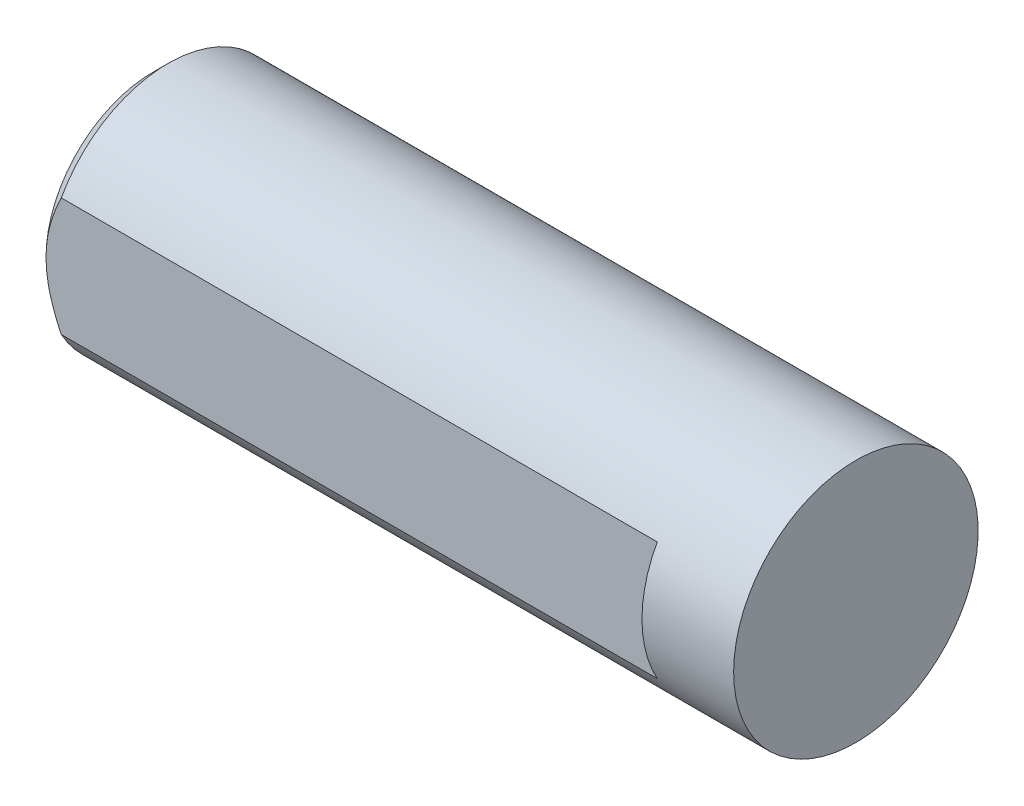
ISO-10303-21;
HEADER;
FILE_DESCRIPTION(('STEP AP214'),'2;1');
FILE_NAME('part.step','',(''),(''),'','','');
FILE_SCHEMA(('AUTOMOTIVE_DESIGN { 1 0 10303 214 1 1 1 1 }'));
ENDSEC;
DATA;
#1=APPLICATION_CONTEXT('core data for automotive mechanical design processes');
#2=APPLICATION_PROTOCOL_DEFINITION('international standard','automotive_design',2000,#1);
#3=PRODUCT_CONTEXT('',#1,'mechanical');
#4=PRODUCT('Part','Part','',(#3));
#5=PRODUCT_RELATED_PRODUCT_CATEGORY('part','',(#4));
#6=PRODUCT_DEFINITION_FORMATION('','',#4);
#7=PRODUCT_DEFINITION_CONTEXT('part definition',#1,'design');
#8=PRODUCT_DEFINITION('design','',#6,#7);
#9=PRODUCT_DEFINITION_SHAPE('','',#8);
#10=(LENGTH_UNIT() NAMED_UNIT(*) SI_UNIT(.MILLI.,.METRE.));
#11=(NAMED_UNIT(*) PLANE_ANGLE_UNIT() SI_UNIT($,.RADIAN.));
#12=(NAMED_UNIT(*) SI_UNIT($,.STERADIAN.) SOLID_ANGLE_UNIT());
#13=UNCERTAINTY_MEASURE_WITH_UNIT(LENGTH_MEASURE(1.E-05),#10,'distance_accuracy_value','');
#14=(GEOMETRIC_REPRESENTATION_CONTEXT(3) GLOBAL_UNCERTAINTY_ASSIGNED_CONTEXT((#13)) GLOBAL_UNIT_ASSIGNED_CONTEXT((#10,
#11,#12)) REPRESENTATION_CONTEXT('',''));
#15=CARTESIAN_POINT('',(0.,0.,0.));
#16=DIRECTION('',(0.,0.,1.));
#17=DIRECTION('',(1.,0.,0.));
#18=AXIS2_PLACEMENT_3D('',#15,#16,#17);
#19=CARTESIAN_POINT('',(0.,0.,0.));
#20=DIRECTION('',(1.,0.,0.));
#21=DIRECTION('',(0.,0.,-1.));
#22=AXIS2_PLACEMENT_3D('',#19,#20,#21);
#23=PLANE('',#22);
#24=CARTESIAN_POINT('',(0.,0.,0.));
#25=DIRECTION('',(1.,0.,0.));
#26=DIRECTION('',(0.,0.,-1.));
#27=AXIS2_PLACEMENT_3D('',#24,#25,#26);
#28=CIRCLE('',#27,3.5);
#29=CARTESIAN_POINT('',(0.,0.,3.5));
#30=VERTEX_POINT('',#29);
#31=EDGE_CURVE('E91',#30,#30,#28,.F.);
#32=ORIENTED_EDGE('',*,*,#31,.T.);
#33=EDGE_LOOP('',(#32));
#34=FACE_BOUND('',#33,.T.);
#35=ADVANCED_FACE('F38',(#34),#23,.F.);
#36=CARTESIAN_POINT('',(-20.5955056179775,0.,0.));
#37=DIRECTION('',(-1.,0.,0.));
#38=DIRECTION('',(0.,0.,1.));
#39=AXIS2_PLACEMENT_3D('',#36,#37,#38);
#40=CYLINDRICAL_SURFACE('',#39,4.);
#41=CARTESIAN_POINT('',(23.,0.,0.));
#42=DIRECTION('',(-1.,0.,0.));
#43=DIRECTION('',(0.,0.,1.));
#44=AXIS2_PLACEMENT_3D('',#41,#42,#43);
#45=CIRCLE('',#44,4.);
#46=CARTESIAN_POINT('',(23.,0.,4.));
#47=VERTEX_POINT('',#46);
#48=EDGE_CURVE('E80',#47,#47,#45,.T.);
#49=ORIENTED_EDGE('',*,*,#48,.T.);
#50=EDGE_LOOP('',(#49));
#51=FACE_BOUND('',#50,.T.);
#52=DIRECTION('',(-1.,0.,0.));
#53=VECTOR('',#52,1.);
#54=CARTESIAN_POINT('',(-20.5955056179775,-1.93649167310371,3.5));
#55=LINE('',#54,#53);
#56=CARTESIAN_POINT('',(0.500000000000004,-1.93649167310371,3.5));
#57=VERTEX_POINT('',#56);
#58=CARTESIAN_POINT('',(20.,-1.93649167310371,3.5));
#59=VERTEX_POINT('',#58);
#60=EDGE_CURVE('E68',#57,#59,#55,.F.);
#61=ORIENTED_EDGE('',*,*,#60,.F.);
#62=CARTESIAN_POINT('',(0.500000000000004,0.,0.));
#63=DIRECTION('',(1.,0.,0.));
#64=DIRECTION('',(0.,0.,-1.));
#65=AXIS2_PLACEMENT_3D('',#62,#63,#64);
#66=CIRCLE('',#65,4.);
#67=CARTESIAN_POINT('',(0.500000000000004,1.93649167310371,3.5));
#68=VERTEX_POINT('',#67);
#69=EDGE_CURVE('E11',#57,#68,#66,.T.);
#70=ORIENTED_EDGE('',*,*,#69,.T.);
#71=DIRECTION('',(-1.,0.,0.));
#72=VECTOR('',#71,1.);
#73=CARTESIAN_POINT('',(-20.5955056179775,1.93649167310371,3.5));
#74=LINE('',#73,#72);
#75=CARTESIAN_POINT('',(20.,1.93649167310371,3.5));
#76=VERTEX_POINT('',#75);
#77=EDGE_CURVE('E74',#76,#68,#74,.T.);
#78=ORIENTED_EDGE('',*,*,#77,.F.);
#79=CARTESIAN_POINT('',(20.,0.,0.));
#80=DIRECTION('',(1.,0.,0.));
#81=DIRECTION('',(0.,0.,-1.));
#82=AXIS2_PLACEMENT_3D('',#79,#80,#81);
#83=CIRCLE('',#82,4.);
#84=EDGE_CURVE('E75',#76,#59,#83,.T.);
#85=ORIENTED_EDGE('',*,*,#84,.T.);
#86=EDGE_LOOP('',(#61,#70,#78,#85));
#87=FACE_BOUND('',#86,.T.);
#88=ADVANCED_FACE('F82',(#51,#87),#40,.T.);
#89=CARTESIAN_POINT('',(23.,0.,0.));
#90=DIRECTION('',(-1.,0.,0.));
#91=DIRECTION('',(0.,0.,1.));
#92=AXIS2_PLACEMENT_3D('',#89,#90,#91);
#93=PLANE('',#92);
#94=ORIENTED_EDGE('',*,*,#48,.F.);
#95=EDGE_LOOP('',(#94));
#96=FACE_BOUND('',#95,.T.);
#97=ADVANCED_FACE('F112',(#96),#93,.F.);
#98=CARTESIAN_POINT('',(20.,5.,3.5));
#99=DIRECTION('',(1.,0.,0.));
#100=DIRECTION('',(0.,0.,-1.));
#101=AXIS2_PLACEMENT_3D('',#98,#99,#100);
#102=PLANE('',#101);
#103=DIRECTION('',(0.,1.,0.));
#104=VECTOR('',#103,1.);
#105=CARTESIAN_POINT('',(20.,5.,3.5));
#106=LINE('',#105,#104);
#107=EDGE_CURVE('E71',#59,#76,#106,.T.);
#108=ORIENTED_EDGE('',*,*,#107,.F.);
#109=ORIENTED_EDGE('',*,*,#84,.F.);
#110=EDGE_LOOP('',(#108,#109));
#111=FACE_BOUND('',#110,.T.);
#112=ADVANCED_FACE('F78',(#111),#102,.F.);
#113=CARTESIAN_POINT('',(0.,0.,3.5));
#114=DIRECTION('',(0.,0.,1.));
#115=DIRECTION('',(1.,0.,0.));
#116=AXIS2_PLACEMENT_3D('',#113,#114,#115);
#117=PLANE('',#116);
#118=CARTESIAN_POINT('',(0.500000000000004,1.93649167310371,3.5));
#119=CARTESIAN_POINT('',(0.434762736264802,1.80164497176726,3.5));
#120=CARTESIAN_POINT('',(0.373575206678307,1.66457098308315,3.5));
#121=CARTESIAN_POINT('',(0.261956754370375,1.3852404622089,3.5));
#122=CARTESIAN_POINT('',(0.211589280169191,1.24295879634616,3.5));
#123=CARTESIAN_POINT('',(0.126260870362103,0.957964142076901,3.5));
#124=CARTESIAN_POINT('',(0.0909174767374602,0.815368580178058,3.5));
#125=CARTESIAN_POINT('',(0.0366982875440895,0.527355180962285,3.5));
#126=CARTESIAN_POINT('',(0.0177766566297658,0.381946364669717,3.5));
#127=CARTESIAN_POINT('',(0.00530798053625585,0.196806714012724,3.5));
#128=CARTESIAN_POINT('',(0.00332378975407401,0.157558468243214,3.5));
#129=CARTESIAN_POINT('',(0.000668017114348398,0.0788758838910554,3.5));
#130=CARTESIAN_POINT('',(1.19563672340997E-06,0.0394413847077833,3.5));
#131=CARTESIAN_POINT('',(0.,0.,3.5));
#132=B_SPLINE_CURVE_WITH_KNOTS('',3,(#118,#119,#120,#121,#122,#123,#124,#125,#126,#127,#128,
#129,#130,#131),.UNSPECIFIED.,.F.,.F.,(4,2,2,2,2,2,4),(0.,0.44969657801215,0.901962231908641,
1.34190254514455,1.78061093996759,1.89849062730156,2.0167955052743),.UNSPECIFIED.);
#133=EDGE_CURVE('E95',#68,#30,#132,.T.);
#134=ORIENTED_EDGE('',*,*,#133,.T.);
#135=CARTESIAN_POINT('',(0.,0.,3.5));
#136=CARTESIAN_POINT('',(-4.29922063787671E-06,-0.0537467282966535,3.5));
#137=CARTESIAN_POINT('',(0.00123864077942715,-0.107485412101768,3.5));
#138=CARTESIAN_POINT('',(0.00617848493380491,-0.214841712901826,3.5));
#139=CARTESIAN_POINT('',(0.00987500485915611,-0.268459347534047,3.5));
#140=CARTESIAN_POINT('',(0.0245657678789977,-0.428791077671286,3.5));
#141=CARTESIAN_POINT('',(0.0391615281617242,-0.535193061064634,3.5));
#142=CARTESIAN_POINT('',(0.0769040576639975,-0.744803501539116,3.5));
#143=CARTESIAN_POINT('',(0.0999213294215302,-0.848035915186264,3.5));
#144=CARTESIAN_POINT('',(0.153504515137813,-1.0525393895166,3.5));
#145=CARTESIAN_POINT('',(0.184072543789824,-1.15380989215638,3.5));
#146=CARTESIAN_POINT('',(0.237454197609205,-1.31208196831694,3.5));
#147=CARTESIAN_POINT('',(0.258135170576332,-1.36981851759891,3.5));
#148=CARTESIAN_POINT('',(0.301451836388314,-1.48453880356192,3.5));
#149=CARTESIAN_POINT('',(0.324087045648105,-1.54152272248367,3.5));
#150=CARTESIAN_POINT('',(0.371329804603564,-1.65526327998893,3.5));
#151=CARTESIAN_POINT('',(0.395953225474943,-1.71201329446651,3.5));
#152=CARTESIAN_POINT('',(0.446812715501891,-1.82479000868548,3.5));
#153=CARTESIAN_POINT('',(0.473048856753766,-1.8808166759541,3.5));
#154=CARTESIAN_POINT('',(0.500000000000004,-1.93649167310371,3.5));
#155=B_SPLINE_CURVE_WITH_KNOTS('',3,(#135,#136,#137,#138,#139,#140,#141,#142,#143,#144,#145,
#146,#147,#148,#149,#150,#151,#152,#153,#154),.UNSPECIFIED.,.F.,.F.,(4,2,2,2,2,2,2,2,2,4),(0.,
0.161210431703254,0.322395623915902,0.644141179095859,0.961134016818529,1.27821573359944,
1.46217088394504,1.64608064347332,1.8316401359309,2.01720792982576),.UNSPECIFIED.);
#156=EDGE_CURVE('E48',#30,#57,#155,.T.);
#157=ORIENTED_EDGE('',*,*,#156,.T.);
#158=ORIENTED_EDGE('',*,*,#60,.T.);
#159=ORIENTED_EDGE('',*,*,#107,.T.);
#160=ORIENTED_EDGE('',*,*,#77,.T.);
#161=EDGE_LOOP('',(#134,#157,#158,#159,#160));
#162=FACE_BOUND('',#161,.T.);
#163=ADVANCED_FACE('F70',(#162),#117,.T.);
#164=CARTESIAN_POINT('',(0.,0.,0.));
#165=DIRECTION('',(1.,0.,0.));
#166=DIRECTION('',(0.,0.,-1.));
#167=AXIS2_PLACEMENT_3D('',#164,#165,#166);
#168=CONICAL_SURFACE('',#167,3.5,0.785398163397448);
#169=ORIENTED_EDGE('',*,*,#133,.F.);
#170=ORIENTED_EDGE('',*,*,#69,.F.);
#171=ORIENTED_EDGE('',*,*,#156,.F.);
#172=ORIENTED_EDGE('',*,*,#31,.F.);
#173=EDGE_LOOP('',(#169,#170,#171,#172));
#174=FACE_BOUND('',#173,.T.);
#175=ADVANCED_FACE('F40',(#174),#168,.T.);
#176=CLOSED_SHELL('',(#35,#88,#97,#112,#163,#175));
#177=MANIFOLD_SOLID_BREP('B2',#176);
#178=ADVANCED_BREP_SHAPE_REPRESENTATION('',(#18,#177),#14);
#179=SHAPE_DEFINITION_REPRESENTATION(#9,#178);
ENDSEC;
END-ISO-10303-21;
